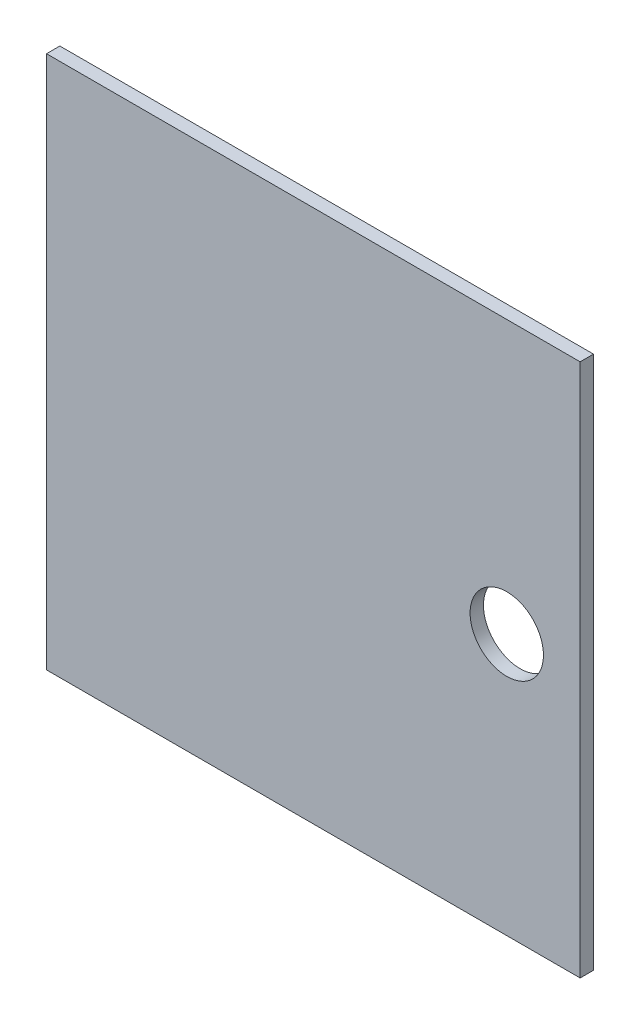
ISO-10303-21;
HEADER;
FILE_DESCRIPTION(('STEP AP214'),'2;1');
FILE_NAME('part.step','',(''),(''),'','','');
FILE_SCHEMA(('AUTOMOTIVE_DESIGN { 1 0 10303 214 1 1 1 1 }'));
ENDSEC;
DATA;
#1=APPLICATION_CONTEXT('core data for automotive mechanical design processes');
#2=APPLICATION_PROTOCOL_DEFINITION('international standard','automotive_design',2000,#1);
#3=PRODUCT_CONTEXT('',#1,'mechanical');
#4=PRODUCT('Part','Part','',(#3));
#5=PRODUCT_RELATED_PRODUCT_CATEGORY('part','',(#4));
#6=PRODUCT_DEFINITION_FORMATION('','',#4);
#7=PRODUCT_DEFINITION_CONTEXT('part definition',#1,'design');
#8=PRODUCT_DEFINITION('design','',#6,#7);
#9=PRODUCT_DEFINITION_SHAPE('','',#8);
#10=(LENGTH_UNIT() NAMED_UNIT(*) SI_UNIT(.MILLI.,.METRE.));
#11=(NAMED_UNIT(*) PLANE_ANGLE_UNIT() SI_UNIT($,.RADIAN.));
#12=(NAMED_UNIT(*) SI_UNIT($,.STERADIAN.) SOLID_ANGLE_UNIT());
#13=UNCERTAINTY_MEASURE_WITH_UNIT(LENGTH_MEASURE(1.E-05),#10,'distance_accuracy_value','');
#14=(GEOMETRIC_REPRESENTATION_CONTEXT(3) GLOBAL_UNCERTAINTY_ASSIGNED_CONTEXT((#13)) GLOBAL_UNIT_ASSIGNED_CONTEXT((#10,
#11,#12)) REPRESENTATION_CONTEXT('',''));
#15=CARTESIAN_POINT('',(0.,0.,0.));
#16=DIRECTION('',(0.,0.,1.));
#17=DIRECTION('',(1.,0.,0.));
#18=AXIS2_PLACEMENT_3D('',#15,#16,#17);
#19=CARTESIAN_POINT('',(0.,0.,2.5));
#20=DIRECTION('',(-1.,0.,0.));
#21=DIRECTION('',(0.,0.,1.));
#22=AXIS2_PLACEMENT_3D('',#19,#20,#21);
#23=PLANE('',#22);
#24=DIRECTION('',(0.,1.,0.));
#25=VECTOR('',#24,1.);
#26=CARTESIAN_POINT('',(0.,0.,0.));
#27=LINE('',#26,#25);
#28=CARTESIAN_POINT('',(0.,0.,0.));
#29=VERTEX_POINT('',#28);
#30=CARTESIAN_POINT('',(0.,100.,0.));
#31=VERTEX_POINT('',#30);
#32=EDGE_CURVE('E101',#29,#31,#27,.T.);
#33=ORIENTED_EDGE('',*,*,#32,.F.);
#34=DIRECTION('',(0.,0.,-1.));
#35=VECTOR('',#34,1.);
#36=CARTESIAN_POINT('',(0.,0.,2.5));
#37=LINE('',#36,#35);
#38=CARTESIAN_POINT('',(0.,0.,2.5));
#39=VERTEX_POINT('',#38);
#40=EDGE_CURVE('E11',#39,#29,#37,.T.);
#41=ORIENTED_EDGE('',*,*,#40,.F.);
#42=DIRECTION('',(0.,1.,0.));
#43=VECTOR('',#42,1.);
#44=CARTESIAN_POINT('',(0.,0.,2.5));
#45=LINE('',#44,#43);
#46=CARTESIAN_POINT('',(0.,100.,2.5));
#47=VERTEX_POINT('',#46);
#48=EDGE_CURVE('E95',#39,#47,#45,.T.);
#49=ORIENTED_EDGE('',*,*,#48,.T.);
#50=DIRECTION('',(0.,0.,-1.));
#51=VECTOR('',#50,1.);
#52=CARTESIAN_POINT('',(0.,100.,2.5));
#53=LINE('',#52,#51);
#54=EDGE_CURVE('E38',#47,#31,#53,.T.);
#55=ORIENTED_EDGE('',*,*,#54,.T.);
#56=EDGE_LOOP('',(#33,#41,#49,#55));
#57=FACE_BOUND('',#56,.T.);
#58=ADVANCED_FACE('F35',(#57),#23,.T.);
#59=CARTESIAN_POINT('',(0.,0.,2.5));
#60=DIRECTION('',(0.,1.,0.));
#61=DIRECTION('',(0.,0.,1.));
#62=AXIS2_PLACEMENT_3D('',#59,#60,#61);
#63=PLANE('',#62);
#64=DIRECTION('',(1.,0.,0.));
#65=VECTOR('',#64,1.);
#66=CARTESIAN_POINT('',(0.,0.,0.));
#67=LINE('',#66,#65);
#68=CARTESIAN_POINT('',(100.,0.,0.));
#69=VERTEX_POINT('',#68);
#70=EDGE_CURVE('E68',#29,#69,#67,.T.);
#71=ORIENTED_EDGE('',*,*,#70,.T.);
#72=DIRECTION('',(0.,0.,-1.));
#73=VECTOR('',#72,1.);
#74=CARTESIAN_POINT('',(100.,0.,2.5));
#75=LINE('',#74,#73);
#76=CARTESIAN_POINT('',(100.,0.,2.5));
#77=VERTEX_POINT('',#76);
#78=EDGE_CURVE('E44',#77,#69,#75,.T.);
#79=ORIENTED_EDGE('',*,*,#78,.F.);
#80=DIRECTION('',(1.,0.,0.));
#81=VECTOR('',#80,1.);
#82=CARTESIAN_POINT('',(0.,0.,2.5));
#83=LINE('',#82,#81);
#84=EDGE_CURVE('E85',#39,#77,#83,.T.);
#85=ORIENTED_EDGE('',*,*,#84,.F.);
#86=ORIENTED_EDGE('',*,*,#40,.T.);
#87=EDGE_LOOP('',(#71,#79,#85,#86));
#88=FACE_BOUND('',#87,.T.);
#89=ADVANCED_FACE('F112',(#88),#63,.F.);
#90=CARTESIAN_POINT('',(100.,0.,2.5));
#91=DIRECTION('',(-1.,0.,0.));
#92=DIRECTION('',(0.,0.,1.));
#93=AXIS2_PLACEMENT_3D('',#90,#91,#92);
#94=PLANE('',#93);
#95=DIRECTION('',(0.,1.,0.));
#96=VECTOR('',#95,1.);
#97=CARTESIAN_POINT('',(100.,0.,0.));
#98=LINE('',#97,#96);
#99=CARTESIAN_POINT('',(100.,100.,0.));
#100=VERTEX_POINT('',#99);
#101=EDGE_CURVE('E92',#69,#100,#98,.T.);
#102=ORIENTED_EDGE('',*,*,#101,.T.);
#103=DIRECTION('',(0.,0.,-1.));
#104=VECTOR('',#103,1.);
#105=CARTESIAN_POINT('',(100.,100.,2.5));
#106=LINE('',#105,#104);
#107=CARTESIAN_POINT('',(100.,100.,2.5));
#108=VERTEX_POINT('',#107);
#109=EDGE_CURVE('E89',#108,#100,#106,.T.);
#110=ORIENTED_EDGE('',*,*,#109,.F.);
#111=DIRECTION('',(0.,1.,0.));
#112=VECTOR('',#111,1.);
#113=CARTESIAN_POINT('',(100.,0.,2.5));
#114=LINE('',#113,#112);
#115=EDGE_CURVE('E80',#77,#108,#114,.T.);
#116=ORIENTED_EDGE('',*,*,#115,.F.);
#117=ORIENTED_EDGE('',*,*,#78,.T.);
#118=EDGE_LOOP('',(#102,#110,#116,#117));
#119=FACE_BOUND('',#118,.T.);
#120=ADVANCED_FACE('F90',(#119),#94,.F.);
#121=CARTESIAN_POINT('',(0.,100.,2.5));
#122=DIRECTION('',(0.,1.,0.));
#123=DIRECTION('',(0.,0.,1.));
#124=AXIS2_PLACEMENT_3D('',#121,#122,#123);
#125=PLANE('',#124);
#126=DIRECTION('',(1.,0.,0.));
#127=VECTOR('',#126,1.);
#128=CARTESIAN_POINT('',(0.,100.,0.));
#129=LINE('',#128,#127);
#130=EDGE_CURVE('E104',#31,#100,#129,.T.);
#131=ORIENTED_EDGE('',*,*,#130,.F.);
#132=ORIENTED_EDGE('',*,*,#54,.F.);
#133=DIRECTION('',(1.,0.,0.));
#134=VECTOR('',#133,1.);
#135=CARTESIAN_POINT('',(0.,100.,2.5));
#136=LINE('',#135,#134);
#137=EDGE_CURVE('E84',#47,#108,#136,.T.);
#138=ORIENTED_EDGE('',*,*,#137,.T.);
#139=ORIENTED_EDGE('',*,*,#109,.T.);
#140=EDGE_LOOP('',(#131,#132,#138,#139));
#141=FACE_BOUND('',#140,.T.);
#142=ADVANCED_FACE('F94',(#141),#125,.T.);
#143=CARTESIAN_POINT('',(0.,0.,2.5));
#144=DIRECTION('',(0.,0.,-1.));
#145=DIRECTION('',(-1.,0.,0.));
#146=AXIS2_PLACEMENT_3D('',#143,#144,#145);
#147=PLANE('',#146);
#148=CARTESIAN_POINT('',(86.250042234467,48.9430319989376,2.5));
#149=DIRECTION('',(0.,0.,1.));
#150=DIRECTION('',(1.,0.,0.));
#151=AXIS2_PLACEMENT_3D('',#148,#149,#150);
#152=CIRCLE('',#151,6.87499999999999);
#153=CARTESIAN_POINT('',(93.125042234467,48.9430319989376,2.5));
#154=VERTEX_POINT('',#153);
#155=EDGE_CURVE('E143',#154,#154,#152,.T.);
#156=ORIENTED_EDGE('',*,*,#155,.F.);
#157=EDGE_LOOP('',(#156));
#158=FACE_BOUND('',#157,.T.);
#159=ORIENTED_EDGE('',*,*,#48,.F.);
#160=ORIENTED_EDGE('',*,*,#84,.T.);
#161=ORIENTED_EDGE('',*,*,#115,.T.);
#162=ORIENTED_EDGE('',*,*,#137,.F.);
#163=EDGE_LOOP('',(#159,#160,#161,#162));
#164=FACE_BOUND('',#163,.T.);
#165=ADVANCED_FACE('F83',(#158,#164),#147,.F.);
#166=CARTESIAN_POINT('',(0.,0.,0.));
#167=DIRECTION('',(0.,0.,-1.));
#168=DIRECTION('',(-1.,0.,0.));
#169=AXIS2_PLACEMENT_3D('',#166,#167,#168);
#170=PLANE('',#169);
#171=CARTESIAN_POINT('',(86.250042234467,48.9430319989376,0.));
#172=DIRECTION('',(0.,0.,1.));
#173=DIRECTION('',(1.,0.,0.));
#174=AXIS2_PLACEMENT_3D('',#171,#172,#173);
#175=CIRCLE('',#174,6.87499999999999);
#176=CARTESIAN_POINT('',(93.125042234467,48.9430319989376,0.));
#177=VERTEX_POINT('',#176);
#178=EDGE_CURVE('E105',#177,#177,#175,.T.);
#179=ORIENTED_EDGE('',*,*,#178,.T.);
#180=EDGE_LOOP('',(#179));
#181=FACE_BOUND('',#180,.T.);
#182=ORIENTED_EDGE('',*,*,#32,.T.);
#183=ORIENTED_EDGE('',*,*,#130,.T.);
#184=ORIENTED_EDGE('',*,*,#101,.F.);
#185=ORIENTED_EDGE('',*,*,#70,.F.);
#186=EDGE_LOOP('',(#182,#183,#184,#185));
#187=FACE_BOUND('',#186,.T.);
#188=ADVANCED_FACE('F110',(#181,#187),#170,.T.);
#189=CARTESIAN_POINT('',(86.250042234467,48.9430319989376,0.));
#190=DIRECTION('',(0.,0.,1.));
#191=DIRECTION('',(1.,0.,0.));
#192=AXIS2_PLACEMENT_3D('',#189,#190,#191);
#193=CYLINDRICAL_SURFACE('',#192,6.87499999999999);
#194=ORIENTED_EDGE('',*,*,#178,.F.);
#195=EDGE_LOOP('',(#194));
#196=FACE_BOUND('',#195,.T.);
#197=ORIENTED_EDGE('',*,*,#155,.T.);
#198=EDGE_LOOP('',(#197));
#199=FACE_BOUND('',#198,.T.);
#200=ADVANCED_FACE('F131',(#196,#199),#193,.F.);
#201=CLOSED_SHELL('',(#58,#89,#120,#142,#165,#188,#200));
#202=MANIFOLD_SOLID_BREP('B2',#201);
#203=ADVANCED_BREP_SHAPE_REPRESENTATION('',(#18,#202),#14);
#204=SHAPE_DEFINITION_REPRESENTATION(#9,#203);
ENDSEC;
END-ISO-10303-21;
